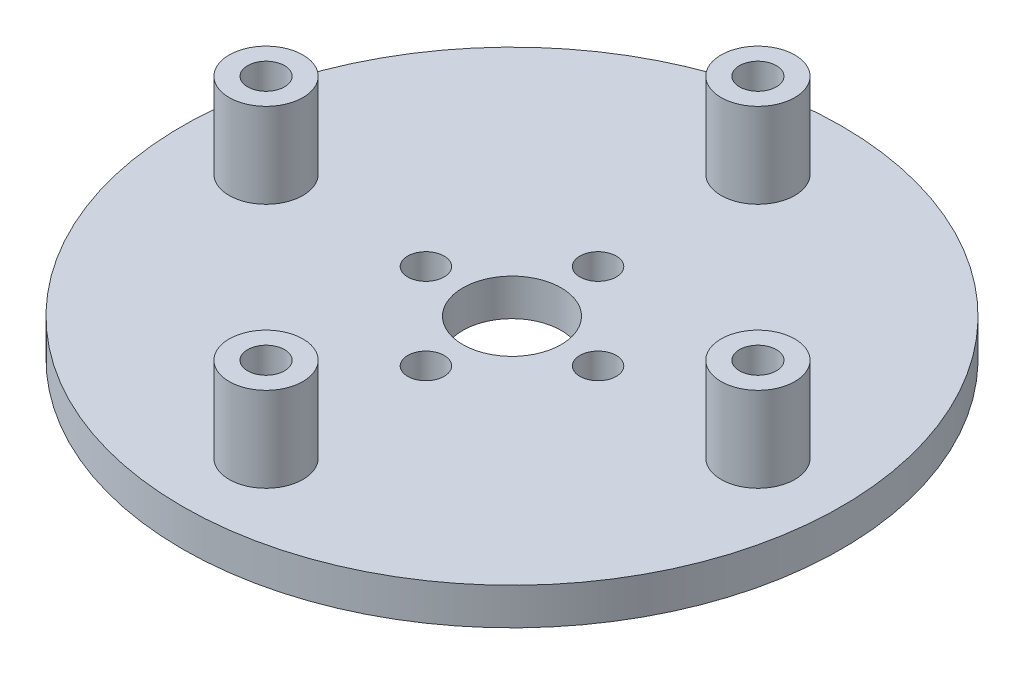
ISO-10303-21;
HEADER;
FILE_DESCRIPTION(('STEP AP214'),'2;1');
FILE_NAME('part.step','',(''),(''),'','','');
FILE_SCHEMA(('AUTOMOTIVE_DESIGN { 1 0 10303 214 1 1 1 1 }'));
ENDSEC;
DATA;
#1=APPLICATION_CONTEXT('core data for automotive mechanical design processes');
#2=APPLICATION_PROTOCOL_DEFINITION('international standard','automotive_design',2000,#1);
#3=PRODUCT_CONTEXT('',#1,'mechanical');
#4=PRODUCT('Part','Part','',(#3));
#5=PRODUCT_RELATED_PRODUCT_CATEGORY('part','',(#4));
#6=PRODUCT_DEFINITION_FORMATION('','',#4);
#7=PRODUCT_DEFINITION_CONTEXT('part definition',#1,'design');
#8=PRODUCT_DEFINITION('design','',#6,#7);
#9=PRODUCT_DEFINITION_SHAPE('','',#8);
#10=(LENGTH_UNIT() NAMED_UNIT(*) SI_UNIT(.MILLI.,.METRE.));
#11=(NAMED_UNIT(*) PLANE_ANGLE_UNIT() SI_UNIT($,.RADIAN.));
#12=(NAMED_UNIT(*) SI_UNIT($,.STERADIAN.) SOLID_ANGLE_UNIT());
#13=UNCERTAINTY_MEASURE_WITH_UNIT(LENGTH_MEASURE(1.E-05),#10,'distance_accuracy_value','');
#14=(GEOMETRIC_REPRESENTATION_CONTEXT(3) GLOBAL_UNCERTAINTY_ASSIGNED_CONTEXT((#13)) GLOBAL_UNIT_ASSIGNED_CONTEXT((#10,
#11,#12)) REPRESENTATION_CONTEXT('',''));
#15=CARTESIAN_POINT('',(0.,0.,0.));
#16=DIRECTION('',(0.,0.,1.));
#17=DIRECTION('',(1.,0.,0.));
#18=AXIS2_PLACEMENT_3D('',#15,#16,#17);
#19=CARTESIAN_POINT('',(0.,3.,-20.));
#20=DIRECTION('',(0.,-1.,0.));
#21=DIRECTION('',(0.,0.,-1.));
#22=AXIS2_PLACEMENT_3D('',#19,#20,#21);
#23=CYLINDRICAL_SURFACE('',#22,1.5);
#24=CARTESIAN_POINT('',(0.,9.9,-20.));
#25=DIRECTION('',(0.,1.,0.));
#26=DIRECTION('',(0.,0.,1.));
#27=AXIS2_PLACEMENT_3D('',#24,#25,#26);
#28=CIRCLE('',#27,1.5);
#29=CARTESIAN_POINT('',(0.,9.9,-18.5));
#30=VERTEX_POINT('',#29);
#31=EDGE_CURVE('E97',#30,#30,#28,.T.);
#32=ORIENTED_EDGE('',*,*,#31,.T.);
#33=EDGE_LOOP('',(#32));
#34=FACE_BOUND('',#33,.T.);
#35=CARTESIAN_POINT('',(0.,2.,-20.));
#36=DIRECTION('',(0.,-1.,0.));
#37=DIRECTION('',(0.,0.,-1.));
#38=AXIS2_PLACEMENT_3D('',#35,#36,#37);
#39=CIRCLE('',#38,1.5);
#40=CARTESIAN_POINT('',(0.,2.,-21.5));
#41=VERTEX_POINT('',#40);
#42=EDGE_CURVE('E38',#41,#41,#39,.T.);
#43=ORIENTED_EDGE('',*,*,#42,.T.);
#44=EDGE_LOOP('',(#43));
#45=FACE_BOUND('',#44,.T.);
#46=ADVANCED_FACE('F34',(#34,#45),#23,.F.);
#47=CARTESIAN_POINT('',(20.,3.,0.));
#48=DIRECTION('',(0.,-1.,0.));
#49=DIRECTION('',(0.,0.,-1.));
#50=AXIS2_PLACEMENT_3D('',#47,#48,#49);
#51=CYLINDRICAL_SURFACE('',#50,1.5);
#52=CARTESIAN_POINT('',(20.,9.9,0.));
#53=DIRECTION('',(0.,1.,0.));
#54=DIRECTION('',(0.,0.,1.));
#55=AXIS2_PLACEMENT_3D('',#52,#53,#54);
#56=CIRCLE('',#55,1.5);
#57=CARTESIAN_POINT('',(20.,9.9,1.5));
#58=VERTEX_POINT('',#57);
#59=EDGE_CURVE('E80',#58,#58,#56,.T.);
#60=ORIENTED_EDGE('',*,*,#59,.T.);
#61=EDGE_LOOP('',(#60));
#62=FACE_BOUND('',#61,.T.);
#63=CARTESIAN_POINT('',(20.,2.,0.));
#64=DIRECTION('',(0.,-1.,0.));
#65=DIRECTION('',(0.,0.,-1.));
#66=AXIS2_PLACEMENT_3D('',#63,#64,#65);
#67=CIRCLE('',#66,1.5);
#68=CARTESIAN_POINT('',(20.,2.,-1.5));
#69=VERTEX_POINT('',#68);
#70=EDGE_CURVE('E59',#69,#69,#67,.T.);
#71=ORIENTED_EDGE('',*,*,#70,.T.);
#72=EDGE_LOOP('',(#71));
#73=FACE_BOUND('',#72,.T.);
#74=ADVANCED_FACE('F154',(#62,#73),#51,.F.);
#75=CARTESIAN_POINT('',(0.,3.,20.));
#76=DIRECTION('',(0.,-1.,0.));
#77=DIRECTION('',(0.,0.,-1.));
#78=AXIS2_PLACEMENT_3D('',#75,#76,#77);
#79=CYLINDRICAL_SURFACE('',#78,1.5);
#80=CARTESIAN_POINT('',(0.,9.9,20.));
#81=DIRECTION('',(0.,1.,0.));
#82=DIRECTION('',(0.,0.,1.));
#83=AXIS2_PLACEMENT_3D('',#80,#81,#82);
#84=CIRCLE('',#83,1.5);
#85=CARTESIAN_POINT('',(0.,9.9,21.5));
#86=VERTEX_POINT('',#85);
#87=EDGE_CURVE('E64',#86,#86,#84,.T.);
#88=ORIENTED_EDGE('',*,*,#87,.T.);
#89=EDGE_LOOP('',(#88));
#90=FACE_BOUND('',#89,.T.);
#91=CARTESIAN_POINT('',(0.,2.,20.));
#92=DIRECTION('',(0.,-1.,0.));
#93=DIRECTION('',(0.,0.,-1.));
#94=AXIS2_PLACEMENT_3D('',#91,#92,#93);
#95=CIRCLE('',#94,1.5);
#96=CARTESIAN_POINT('',(0.,2.,18.5));
#97=VERTEX_POINT('',#96);
#98=EDGE_CURVE('E56',#97,#97,#95,.T.);
#99=ORIENTED_EDGE('',*,*,#98,.T.);
#100=EDGE_LOOP('',(#99));
#101=FACE_BOUND('',#100,.T.);
#102=ADVANCED_FACE('F160',(#90,#101),#79,.F.);
#103=CARTESIAN_POINT('',(-20.,3.,0.));
#104=DIRECTION('',(0.,-1.,0.));
#105=DIRECTION('',(0.,0.,-1.));
#106=AXIS2_PLACEMENT_3D('',#103,#104,#105);
#107=CYLINDRICAL_SURFACE('',#106,1.5);
#108=CARTESIAN_POINT('',(-20.,9.9,0.));
#109=DIRECTION('',(0.,1.,0.));
#110=DIRECTION('',(0.,0.,1.));
#111=AXIS2_PLACEMENT_3D('',#108,#109,#110);
#112=CIRCLE('',#111,1.5);
#113=CARTESIAN_POINT('',(-20.,9.9,1.5));
#114=VERTEX_POINT('',#113);
#115=EDGE_CURVE('E88',#114,#114,#112,.T.);
#116=ORIENTED_EDGE('',*,*,#115,.T.);
#117=EDGE_LOOP('',(#116));
#118=FACE_BOUND('',#117,.T.);
#119=CARTESIAN_POINT('',(-20.,2.,0.));
#120=DIRECTION('',(0.,-1.,0.));
#121=DIRECTION('',(0.,0.,-1.));
#122=AXIS2_PLACEMENT_3D('',#119,#120,#121);
#123=CIRCLE('',#122,1.5);
#124=CARTESIAN_POINT('',(-20.,2.,-1.5));
#125=VERTEX_POINT('',#124);
#126=EDGE_CURVE('E53',#125,#125,#123,.T.);
#127=ORIENTED_EDGE('',*,*,#126,.T.);
#128=EDGE_LOOP('',(#127));
#129=FACE_BOUND('',#128,.T.);
#130=ADVANCED_FACE('F174',(#118,#129),#107,.F.);
#131=CARTESIAN_POINT('',(0.,3.,0.));
#132=DIRECTION('',(0.,1.,0.));
#133=DIRECTION('',(0.,0.,1.));
#134=AXIS2_PLACEMENT_3D('',#131,#132,#133);
#135=PLANE('',#134);
#136=CARTESIAN_POINT('',(20.,3.,0.));
#137=DIRECTION('',(0.,1.,0.));
#138=DIRECTION('',(0.,0.,1.));
#139=AXIS2_PLACEMENT_3D('',#136,#137,#138);
#140=CIRCLE('',#139,3.);
#141=CARTESIAN_POINT('',(20.,3.,-3.));
#142=VERTEX_POINT('',#141);
#143=EDGE_CURVE('E84',#142,#142,#140,.T.);
#144=ORIENTED_EDGE('',*,*,#143,.F.);
#145=EDGE_LOOP('',(#144));
#146=FACE_BOUND('',#145,.T.);
#147=CARTESIAN_POINT('',(0.,3.,-20.));
#148=DIRECTION('',(0.,1.,0.));
#149=DIRECTION('',(0.,0.,1.));
#150=AXIS2_PLACEMENT_3D('',#147,#148,#149);
#151=CIRCLE('',#150,3.);
#152=CARTESIAN_POINT('',(0.,3.,-23.));
#153=VERTEX_POINT('',#152);
#154=EDGE_CURVE('E102',#153,#153,#151,.T.);
#155=ORIENTED_EDGE('',*,*,#154,.F.);
#156=EDGE_LOOP('',(#155));
#157=FACE_BOUND('',#156,.T.);
#158=CARTESIAN_POINT('',(0.,3.,7.));
#159=DIRECTION('',(0.,1.,0.));
#160=DIRECTION('',(0.,0.,1.));
#161=AXIS2_PLACEMENT_3D('',#158,#159,#160);
#162=CIRCLE('',#161,1.48);
#163=CARTESIAN_POINT('',(0.,3.,8.48));
#164=VERTEX_POINT('',#163);
#165=EDGE_CURVE('E121',#164,#164,#162,.T.);
#166=ORIENTED_EDGE('',*,*,#165,.F.);
#167=EDGE_LOOP('',(#166));
#168=FACE_BOUND('',#167,.T.);
#169=CARTESIAN_POINT('',(0.,3.,-7.));
#170=DIRECTION('',(0.,1.,0.));
#171=DIRECTION('',(0.,0.,1.));
#172=AXIS2_PLACEMENT_3D('',#169,#170,#171);
#173=CIRCLE('',#172,1.48);
#174=CARTESIAN_POINT('',(0.,3.,-5.52));
#175=VERTEX_POINT('',#174);
#176=EDGE_CURVE('E127',#175,#175,#173,.T.);
#177=ORIENTED_EDGE('',*,*,#176,.F.);
#178=EDGE_LOOP('',(#177));
#179=FACE_BOUND('',#178,.T.);
#180=CARTESIAN_POINT('',(0.,3.,0.));
#181=DIRECTION('',(0.,1.,0.));
#182=DIRECTION('',(0.,0.,1.));
#183=AXIS2_PLACEMENT_3D('',#180,#181,#182);
#184=CIRCLE('',#183,26.8);
#185=CARTESIAN_POINT('',(0.,3.,26.8));
#186=VERTEX_POINT('',#185);
#187=EDGE_CURVE('E10',#186,#186,#184,.T.);
#188=ORIENTED_EDGE('',*,*,#187,.T.);
#189=EDGE_LOOP('',(#188));
#190=FACE_BOUND('',#189,.T.);
#191=CARTESIAN_POINT('',(0.,3.,0.));
#192=DIRECTION('',(0.,1.,0.));
#193=DIRECTION('',(0.,0.,1.));
#194=AXIS2_PLACEMENT_3D('',#191,#192,#193);
#195=CIRCLE('',#194,4.);
#196=CARTESIAN_POINT('',(0.,3.,4.));
#197=VERTEX_POINT('',#196);
#198=EDGE_CURVE('E47',#197,#197,#195,.T.);
#199=ORIENTED_EDGE('',*,*,#198,.F.);
#200=EDGE_LOOP('',(#199));
#201=FACE_BOUND('',#200,.T.);
#202=CARTESIAN_POINT('',(7.,3.,0.));
#203=DIRECTION('',(0.,1.,0.));
#204=DIRECTION('',(0.,0.,1.));
#205=AXIS2_PLACEMENT_3D('',#202,#203,#204);
#206=CIRCLE('',#205,1.48);
#207=CARTESIAN_POINT('',(7.,3.,1.48));
#208=VERTEX_POINT('',#207);
#209=EDGE_CURVE('E115',#208,#208,#206,.T.);
#210=ORIENTED_EDGE('',*,*,#209,.F.);
#211=EDGE_LOOP('',(#210));
#212=FACE_BOUND('',#211,.T.);
#213=CARTESIAN_POINT('',(-7.,3.,0.));
#214=DIRECTION('',(0.,1.,0.));
#215=DIRECTION('',(0.,0.,1.));
#216=AXIS2_PLACEMENT_3D('',#213,#214,#215);
#217=CIRCLE('',#216,1.48);
#218=CARTESIAN_POINT('',(-7.,3.,1.48));
#219=VERTEX_POINT('',#218);
#220=EDGE_CURVE('E109',#219,#219,#217,.T.);
#221=ORIENTED_EDGE('',*,*,#220,.F.);
#222=EDGE_LOOP('',(#221));
#223=FACE_BOUND('',#222,.T.);
#224=CARTESIAN_POINT('',(-20.,3.,0.));
#225=DIRECTION('',(0.,1.,0.));
#226=DIRECTION('',(0.,0.,1.));
#227=AXIS2_PLACEMENT_3D('',#224,#225,#226);
#228=CIRCLE('',#227,3.);
#229=CARTESIAN_POINT('',(-20.,3.,-3.));
#230=VERTEX_POINT('',#229);
#231=EDGE_CURVE('E93',#230,#230,#228,.T.);
#232=ORIENTED_EDGE('',*,*,#231,.F.);
#233=EDGE_LOOP('',(#232));
#234=FACE_BOUND('',#233,.T.);
#235=CARTESIAN_POINT('',(0.,3.,20.));
#236=DIRECTION('',(0.,1.,0.));
#237=DIRECTION('',(0.,0.,1.));
#238=AXIS2_PLACEMENT_3D('',#235,#236,#237);
#239=CIRCLE('',#238,3.);
#240=CARTESIAN_POINT('',(0.,3.,17.));
#241=VERTEX_POINT('',#240);
#242=EDGE_CURVE('E68',#241,#241,#239,.T.);
#243=ORIENTED_EDGE('',*,*,#242,.F.);
#244=EDGE_LOOP('',(#243));
#245=FACE_BOUND('',#244,.T.);
#246=ADVANCED_FACE('F177',(#146,#157,#168,#179,#190,#201,#212,#223,#234,#245),#135,.T.);
#247=CARTESIAN_POINT('',(0.,0.,0.));
#248=DIRECTION('',(0.,1.,0.));
#249=DIRECTION('',(0.,0.,1.));
#250=AXIS2_PLACEMENT_3D('',#247,#248,#249);
#251=PLANE('',#250);
#252=CARTESIAN_POINT('',(0.,0.,20.));
#253=DIRECTION('',(0.,-1.,0.));
#254=DIRECTION('',(0.,0.,-1.));
#255=AXIS2_PLACEMENT_3D('',#252,#253,#254);
#256=CIRCLE('',#255,3.);
#257=CARTESIAN_POINT('',(0.,0.,17.));
#258=VERTEX_POINT('',#257);
#259=EDGE_CURVE('E251',#258,#258,#256,.T.);
#260=ORIENTED_EDGE('',*,*,#259,.F.);
#261=EDGE_LOOP('',(#260));
#262=FACE_BOUND('',#261,.T.);
#263=CARTESIAN_POINT('',(-20.,0.,0.));
#264=DIRECTION('',(0.,-1.,0.));
#265=DIRECTION('',(0.,0.,-1.));
#266=AXIS2_PLACEMENT_3D('',#263,#264,#265);
#267=CIRCLE('',#266,3.);
#268=CARTESIAN_POINT('',(-20.,0.,-3.));
#269=VERTEX_POINT('',#268);
#270=EDGE_CURVE('E259',#269,#269,#267,.T.);
#271=ORIENTED_EDGE('',*,*,#270,.F.);
#272=EDGE_LOOP('',(#271));
#273=FACE_BOUND('',#272,.T.);
#274=CARTESIAN_POINT('',(0.,0.,-20.));
#275=DIRECTION('',(0.,-1.,0.));
#276=DIRECTION('',(0.,0.,-1.));
#277=AXIS2_PLACEMENT_3D('',#274,#275,#276);
#278=CIRCLE('',#277,3.);
#279=CARTESIAN_POINT('',(0.,0.,-23.));
#280=VERTEX_POINT('',#279);
#281=EDGE_CURVE('E265',#280,#280,#278,.T.);
#282=ORIENTED_EDGE('',*,*,#281,.F.);
#283=EDGE_LOOP('',(#282));
#284=FACE_BOUND('',#283,.T.);
#285=CARTESIAN_POINT('',(20.,0.,0.));
#286=DIRECTION('',(0.,-1.,0.));
#287=DIRECTION('',(0.,0.,-1.));
#288=AXIS2_PLACEMENT_3D('',#285,#286,#287);
#289=CIRCLE('',#288,3.);
#290=CARTESIAN_POINT('',(20.,0.,-3.));
#291=VERTEX_POINT('',#290);
#292=EDGE_CURVE('E77',#291,#291,#289,.T.);
#293=ORIENTED_EDGE('',*,*,#292,.F.);
#294=EDGE_LOOP('',(#293));
#295=FACE_BOUND('',#294,.T.);
#296=CARTESIAN_POINT('',(0.,0.,0.));
#297=DIRECTION('',(0.,1.,0.));
#298=DIRECTION('',(0.,0.,1.));
#299=AXIS2_PLACEMENT_3D('',#296,#297,#298);
#300=CIRCLE('',#299,26.8);
#301=CARTESIAN_POINT('',(0.,0.,26.8));
#302=VERTEX_POINT('',#301);
#303=EDGE_CURVE('E42',#302,#302,#300,.T.);
#304=ORIENTED_EDGE('',*,*,#303,.F.);
#305=EDGE_LOOP('',(#304));
#306=FACE_BOUND('',#305,.T.);
#307=CARTESIAN_POINT('',(0.,0.,0.));
#308=DIRECTION('',(0.,1.,0.));
#309=DIRECTION('',(0.,0.,1.));
#310=AXIS2_PLACEMENT_3D('',#307,#308,#309);
#311=CIRCLE('',#310,4.);
#312=CARTESIAN_POINT('',(0.,0.,4.));
#313=VERTEX_POINT('',#312);
#314=EDGE_CURVE('E50',#313,#313,#311,.T.);
#315=ORIENTED_EDGE('',*,*,#314,.T.);
#316=EDGE_LOOP('',(#315));
#317=FACE_BOUND('',#316,.T.);
#318=CARTESIAN_POINT('',(0.,0.,-7.));
#319=DIRECTION('',(0.,1.,0.));
#320=DIRECTION('',(0.,0.,1.));
#321=AXIS2_PLACEMENT_3D('',#318,#319,#320);
#322=CIRCLE('',#321,1.48);
#323=CARTESIAN_POINT('',(0.,0.,-5.52));
#324=VERTEX_POINT('',#323);
#325=EDGE_CURVE('E124',#324,#324,#322,.T.);
#326=ORIENTED_EDGE('',*,*,#325,.T.);
#327=EDGE_LOOP('',(#326));
#328=FACE_BOUND('',#327,.T.);
#329=CARTESIAN_POINT('',(0.,0.,7.));
#330=DIRECTION('',(0.,1.,0.));
#331=DIRECTION('',(0.,0.,1.));
#332=AXIS2_PLACEMENT_3D('',#329,#330,#331);
#333=CIRCLE('',#332,1.48);
#334=CARTESIAN_POINT('',(0.,0.,8.48));
#335=VERTEX_POINT('',#334);
#336=EDGE_CURVE('E118',#335,#335,#333,.T.);
#337=ORIENTED_EDGE('',*,*,#336,.T.);
#338=EDGE_LOOP('',(#337));
#339=FACE_BOUND('',#338,.T.);
#340=CARTESIAN_POINT('',(7.,0.,0.));
#341=DIRECTION('',(0.,1.,0.));
#342=DIRECTION('',(0.,0.,1.));
#343=AXIS2_PLACEMENT_3D('',#340,#341,#342);
#344=CIRCLE('',#343,1.48);
#345=CARTESIAN_POINT('',(7.,0.,1.48));
#346=VERTEX_POINT('',#345);
#347=EDGE_CURVE('E112',#346,#346,#344,.T.);
#348=ORIENTED_EDGE('',*,*,#347,.T.);
#349=EDGE_LOOP('',(#348));
#350=FACE_BOUND('',#349,.T.);
#351=CARTESIAN_POINT('',(-7.,0.,0.));
#352=DIRECTION('',(0.,1.,0.));
#353=DIRECTION('',(0.,0.,1.));
#354=AXIS2_PLACEMENT_3D('',#351,#352,#353);
#355=CIRCLE('',#354,1.48);
#356=CARTESIAN_POINT('',(-7.,0.,1.48));
#357=VERTEX_POINT('',#356);
#358=EDGE_CURVE('E106',#357,#357,#355,.T.);
#359=ORIENTED_EDGE('',*,*,#358,.T.);
#360=EDGE_LOOP('',(#359));
#361=FACE_BOUND('',#360,.T.);
#362=ADVANCED_FACE('F137',(#262,#273,#284,#295,#306,#317,#328,#339,#350,#361),#251,.F.);
#363=CARTESIAN_POINT('',(0.,3.,0.));
#364=DIRECTION('',(0.,-1.,0.));
#365=DIRECTION('',(0.,0.,-1.));
#366=AXIS2_PLACEMENT_3D('',#363,#364,#365);
#367=CYLINDRICAL_SURFACE('',#366,26.8);
#368=ORIENTED_EDGE('',*,*,#187,.F.);
#369=EDGE_LOOP('',(#368));
#370=FACE_BOUND('',#369,.T.);
#371=ORIENTED_EDGE('',*,*,#303,.T.);
#372=EDGE_LOOP('',(#371));
#373=FACE_BOUND('',#372,.T.);
#374=ADVANCED_FACE('F36',(#370,#373),#367,.T.);
#375=CARTESIAN_POINT('',(0.,3.,0.));
#376=DIRECTION('',(0.,-1.,0.));
#377=DIRECTION('',(0.,0.,-1.));
#378=AXIS2_PLACEMENT_3D('',#375,#376,#377);
#379=CYLINDRICAL_SURFACE('',#378,4.);
#380=ORIENTED_EDGE('',*,*,#198,.T.);
#381=EDGE_LOOP('',(#380));
#382=FACE_BOUND('',#381,.T.);
#383=ORIENTED_EDGE('',*,*,#314,.F.);
#384=EDGE_LOOP('',(#383));
#385=FACE_BOUND('',#384,.T.);
#386=ADVANCED_FACE('F140',(#382,#385),#379,.F.);
#387=CARTESIAN_POINT('',(0.,3.,-7.));
#388=DIRECTION('',(0.,-1.,0.));
#389=DIRECTION('',(0.,0.,-1.));
#390=AXIS2_PLACEMENT_3D('',#387,#388,#389);
#391=CYLINDRICAL_SURFACE('',#390,1.48);
#392=ORIENTED_EDGE('',*,*,#176,.T.);
#393=EDGE_LOOP('',(#392));
#394=FACE_BOUND('',#393,.T.);
#395=ORIENTED_EDGE('',*,*,#325,.F.);
#396=EDGE_LOOP('',(#395));
#397=FACE_BOUND('',#396,.T.);
#398=ADVANCED_FACE('F142',(#394,#397),#391,.F.);
#399=CARTESIAN_POINT('',(0.,3.,7.));
#400=DIRECTION('',(0.,-1.,0.));
#401=DIRECTION('',(0.,0.,-1.));
#402=AXIS2_PLACEMENT_3D('',#399,#400,#401);
#403=CYLINDRICAL_SURFACE('',#402,1.48);
#404=ORIENTED_EDGE('',*,*,#165,.T.);
#405=EDGE_LOOP('',(#404));
#406=FACE_BOUND('',#405,.T.);
#407=ORIENTED_EDGE('',*,*,#336,.F.);
#408=EDGE_LOOP('',(#407));
#409=FACE_BOUND('',#408,.T.);
#410=ADVANCED_FACE('F148',(#406,#409),#403,.F.);
#411=CARTESIAN_POINT('',(7.,3.,0.));
#412=DIRECTION('',(0.,-1.,0.));
#413=DIRECTION('',(0.,0.,-1.));
#414=AXIS2_PLACEMENT_3D('',#411,#412,#413);
#415=CYLINDRICAL_SURFACE('',#414,1.48);
#416=ORIENTED_EDGE('',*,*,#209,.T.);
#417=EDGE_LOOP('',(#416));
#418=FACE_BOUND('',#417,.T.);
#419=ORIENTED_EDGE('',*,*,#347,.F.);
#420=EDGE_LOOP('',(#419));
#421=FACE_BOUND('',#420,.T.);
#422=ADVANCED_FACE('F166',(#418,#421),#415,.F.);
#423=CARTESIAN_POINT('',(-7.,3.,0.));
#424=DIRECTION('',(0.,-1.,0.));
#425=DIRECTION('',(0.,0.,-1.));
#426=AXIS2_PLACEMENT_3D('',#423,#424,#425);
#427=CYLINDRICAL_SURFACE('',#426,1.48);
#428=ORIENTED_EDGE('',*,*,#220,.T.);
#429=EDGE_LOOP('',(#428));
#430=FACE_BOUND('',#429,.T.);
#431=ORIENTED_EDGE('',*,*,#358,.F.);
#432=EDGE_LOOP('',(#431));
#433=FACE_BOUND('',#432,.T.);
#434=ADVANCED_FACE('F169',(#430,#433),#427,.F.);
#435=CARTESIAN_POINT('',(0.,9.9,-20.));
#436=DIRECTION('',(0.,1.,0.));
#437=DIRECTION('',(0.,0.,1.));
#438=AXIS2_PLACEMENT_3D('',#435,#436,#437);
#439=PLANE('',#438);
#440=CARTESIAN_POINT('',(0.,9.9,-20.));
#441=DIRECTION('',(0.,1.,0.));
#442=DIRECTION('',(0.,0.,1.));
#443=AXIS2_PLACEMENT_3D('',#440,#441,#442);
#444=CIRCLE('',#443,3.);
#445=CARTESIAN_POINT('',(0.,9.9,-23.));
#446=VERTEX_POINT('',#445);
#447=EDGE_CURVE('E103',#446,#446,#444,.T.);
#448=ORIENTED_EDGE('',*,*,#447,.T.);
#449=EDGE_LOOP('',(#448));
#450=FACE_BOUND('',#449,.T.);
#451=ORIENTED_EDGE('',*,*,#31,.F.);
#452=EDGE_LOOP('',(#451));
#453=FACE_BOUND('',#452,.T.);
#454=ADVANCED_FACE('F181',(#450,#453),#439,.T.);
#455=CARTESIAN_POINT('',(0.,9.9,-20.));
#456=DIRECTION('',(0.,-1.,0.));
#457=DIRECTION('',(0.,0.,-1.));
#458=AXIS2_PLACEMENT_3D('',#455,#456,#457);
#459=CYLINDRICAL_SURFACE('',#458,3.);
#460=CARTESIAN_POINT('',(0.,9.9,-23.));
#461=CARTESIAN_POINT('',(0.,9.828125,-23.));
#462=CARTESIAN_POINT('',(0.,9.75625,-23.));
#463=CARTESIAN_POINT('',(0.,9.6125,-23.));
#464=CARTESIAN_POINT('',(0.,9.540625,-23.));
#465=CARTESIAN_POINT('',(0.,9.396875,-23.));
#466=CARTESIAN_POINT('',(0.,9.325,-23.));
#467=CARTESIAN_POINT('',(0.,9.18125,-23.));
#468=CARTESIAN_POINT('',(0.,9.109375,-23.));
#469=CARTESIAN_POINT('',(0.,8.965625,-23.));
#470=CARTESIAN_POINT('',(0.,8.89375,-23.));
#471=CARTESIAN_POINT('',(0.,8.75,-23.));
#472=CARTESIAN_POINT('',(0.,8.678125,-23.));
#473=CARTESIAN_POINT('',(0.,8.534375,-23.));
#474=CARTESIAN_POINT('',(0.,8.4625,-23.));
#475=CARTESIAN_POINT('',(0.,8.31875,-23.));
#476=CARTESIAN_POINT('',(0.,8.246875,-23.));
#477=CARTESIAN_POINT('',(0.,8.103125,-23.));
#478=CARTESIAN_POINT('',(0.,8.03125,-23.));
#479=CARTESIAN_POINT('',(0.,7.8875,-23.));
#480=CARTESIAN_POINT('',(0.,7.815625,-23.));
#481=CARTESIAN_POINT('',(0.,7.671875,-23.));
#482=CARTESIAN_POINT('',(0.,7.6,-23.));
#483=CARTESIAN_POINT('',(0.,7.45625,-23.));
#484=CARTESIAN_POINT('',(0.,7.384375,-23.));
#485=CARTESIAN_POINT('',(0.,7.240625,-23.));
#486=CARTESIAN_POINT('',(0.,7.16875,-23.));
#487=CARTESIAN_POINT('',(0.,7.025,-23.));
#488=CARTESIAN_POINT('',(0.,6.953125,-23.));
#489=CARTESIAN_POINT('',(0.,6.809375,-23.));
#490=CARTESIAN_POINT('',(0.,6.7375,-23.));
#491=CARTESIAN_POINT('',(0.,6.59375,-23.));
#492=CARTESIAN_POINT('',(0.,6.521875,-23.));
#493=CARTESIAN_POINT('',(0.,6.378125,-23.));
#494=CARTESIAN_POINT('',(0.,6.30625,-23.));
#495=CARTESIAN_POINT('',(0.,6.1625,-23.));
#496=CARTESIAN_POINT('',(0.,6.090625,-23.));
#497=CARTESIAN_POINT('',(0.,5.946875,-23.));
#498=CARTESIAN_POINT('',(0.,5.875,-23.));
#499=CARTESIAN_POINT('',(0.,5.73125,-23.));
#500=CARTESIAN_POINT('',(0.,5.659375,-23.));
#501=CARTESIAN_POINT('',(0.,5.515625,-23.));
#502=CARTESIAN_POINT('',(0.,5.44375,-23.));
#503=CARTESIAN_POINT('',(0.,5.3,-23.));
#504=CARTESIAN_POINT('',(0.,5.228125,-23.));
#505=CARTESIAN_POINT('',(0.,5.084375,-23.));
#506=CARTESIAN_POINT('',(0.,5.0125,-23.));
#507=CARTESIAN_POINT('',(0.,4.86875,-23.));
#508=CARTESIAN_POINT('',(0.,4.796875,-23.));
#509=CARTESIAN_POINT('',(0.,4.653125,-23.));
#510=CARTESIAN_POINT('',(0.,4.58125,-23.));
#511=CARTESIAN_POINT('',(0.,4.4375,-23.));
#512=CARTESIAN_POINT('',(0.,4.365625,-23.));
#513=CARTESIAN_POINT('',(0.,4.221875,-23.));
#514=CARTESIAN_POINT('',(0.,4.15,-23.));
#515=CARTESIAN_POINT('',(0.,4.00625,-23.));
#516=CARTESIAN_POINT('',(0.,3.934375,-23.));
#517=CARTESIAN_POINT('',(0.,3.790625,-23.));
#518=CARTESIAN_POINT('',(0.,3.71875,-23.));
#519=CARTESIAN_POINT('',(0.,3.575,-23.));
#520=CARTESIAN_POINT('',(0.,3.503125,-23.));
#521=CARTESIAN_POINT('',(0.,3.359375,-23.));
#522=CARTESIAN_POINT('',(0.,3.2875,-23.));
#523=CARTESIAN_POINT('',(0.,3.14375,-23.));
#524=CARTESIAN_POINT('',(0.,3.071875,-23.));
#525=CARTESIAN_POINT('',(0.,3.,-23.));
#526=B_SPLINE_CURVE_WITH_KNOTS('',3,(#460,#461,#462,#463,#464,#465,#466,#467,#468,#469,#470,
#471,#472,#473,#474,#475,#476,#477,#478,#479,#480,#481,#482,#483,#484,#485,#486,#487,#488,#489,
#490,#491,#492,#493,#494,#495,#496,#497,#498,#499,#500,#501,#502,#503,#504,#505,#506,#507,#508,
#509,#510,#511,#512,#513,#514,#515,#516,#517,#518,#519,#520,#521,#522,#523,#524,#525),
.UNSPECIFIED.,.F.,.F.,(4,2,2,2,2,2,2,2,2,2,2,2,2,2,2,2,2,2,2,2,2,2,2,2,2,2,2,2,2,2,2,2,4),(0.,
0.215624999999999,0.431249999999999,0.646875,0.862499999999999,1.078125,1.29375,1.509375,1.725,
1.940625,2.15625,2.371875,2.5875,2.803125,3.01875,3.234375,3.45,3.665625,3.88125,4.096875,
4.3125,4.528125,4.74375,4.959375,5.175,5.390625,5.60625,5.821875,6.0375,6.253125,6.46875,
6.684375,6.9),.UNSPECIFIED.);
#527=EDGE_CURVE('BSEAM183',#446,#153,#526,.T.);
#528=ORIENTED_EDGE('',*,*,#447,.F.);
#529=ORIENTED_EDGE('',*,*,#154,.T.);
#530=ORIENTED_EDGE('',*,*,#527,.T.);
#531=ORIENTED_EDGE('',*,*,#527,.F.);
#532=EDGE_LOOP('',(#528,#530,#529,#531));
#533=FACE_BOUND('',#532,.T.);
#534=ADVANCED_FACE('F183',(#533),#459,.T.);
#535=CARTESIAN_POINT('',(-20.,9.9,0.));
#536=DIRECTION('',(0.,1.,0.));
#537=DIRECTION('',(0.,0.,1.));
#538=AXIS2_PLACEMENT_3D('',#535,#536,#537);
#539=PLANE('',#538);
#540=CARTESIAN_POINT('',(-20.,9.9,0.));
#541=DIRECTION('',(0.,1.,0.));
#542=DIRECTION('',(0.,0.,1.));
#543=AXIS2_PLACEMENT_3D('',#540,#541,#542);
#544=CIRCLE('',#543,3.);
#545=CARTESIAN_POINT('',(-20.,9.9,-3.));
#546=VERTEX_POINT('',#545);
#547=EDGE_CURVE('E94',#546,#546,#544,.T.);
#548=ORIENTED_EDGE('',*,*,#547,.T.);
#549=EDGE_LOOP('',(#548));
#550=FACE_BOUND('',#549,.T.);
#551=ORIENTED_EDGE('',*,*,#115,.F.);
#552=EDGE_LOOP('',(#551));
#553=FACE_BOUND('',#552,.T.);
#554=ADVANCED_FACE('F186',(#550,#553),#539,.T.);
#555=CARTESIAN_POINT('',(-20.,9.9,0.));
#556=DIRECTION('',(0.,-1.,0.));
#557=DIRECTION('',(0.,0.,-1.));
#558=AXIS2_PLACEMENT_3D('',#555,#556,#557);
#559=CYLINDRICAL_SURFACE('',#558,3.);
#560=CARTESIAN_POINT('',(-20.,9.9,-3.));
#561=CARTESIAN_POINT('',(-20.,9.828125,-3.));
#562=CARTESIAN_POINT('',(-20.,9.75625,-3.));
#563=CARTESIAN_POINT('',(-20.,9.6125,-3.));
#564=CARTESIAN_POINT('',(-20.,9.540625,-3.));
#565=CARTESIAN_POINT('',(-20.,9.396875,-3.));
#566=CARTESIAN_POINT('',(-20.,9.325,-3.));
#567=CARTESIAN_POINT('',(-20.,9.18125,-3.));
#568=CARTESIAN_POINT('',(-20.,9.109375,-3.));
#569=CARTESIAN_POINT('',(-20.,8.965625,-3.));
#570=CARTESIAN_POINT('',(-20.,8.89375,-3.));
#571=CARTESIAN_POINT('',(-20.,8.75,-3.));
#572=CARTESIAN_POINT('',(-20.,8.678125,-3.));
#573=CARTESIAN_POINT('',(-20.,8.534375,-3.));
#574=CARTESIAN_POINT('',(-20.,8.4625,-3.));
#575=CARTESIAN_POINT('',(-20.,8.31875,-3.));
#576=CARTESIAN_POINT('',(-20.,8.246875,-3.));
#577=CARTESIAN_POINT('',(-20.,8.103125,-3.));
#578=CARTESIAN_POINT('',(-20.,8.03125,-3.));
#579=CARTESIAN_POINT('',(-20.,7.8875,-3.));
#580=CARTESIAN_POINT('',(-20.,7.815625,-3.));
#581=CARTESIAN_POINT('',(-20.,7.671875,-3.));
#582=CARTESIAN_POINT('',(-20.,7.6,-3.));
#583=CARTESIAN_POINT('',(-20.,7.45625,-3.));
#584=CARTESIAN_POINT('',(-20.,7.384375,-3.));
#585=CARTESIAN_POINT('',(-20.,7.240625,-3.));
#586=CARTESIAN_POINT('',(-20.,7.16875,-3.));
#587=CARTESIAN_POINT('',(-20.,7.025,-3.));
#588=CARTESIAN_POINT('',(-20.,6.953125,-3.));
#589=CARTESIAN_POINT('',(-20.,6.809375,-3.));
#590=CARTESIAN_POINT('',(-20.,6.7375,-3.));
#591=CARTESIAN_POINT('',(-20.,6.59375,-3.));
#592=CARTESIAN_POINT('',(-20.,6.521875,-3.));
#593=CARTESIAN_POINT('',(-20.,6.378125,-3.));
#594=CARTESIAN_POINT('',(-20.,6.30625,-3.));
#595=CARTESIAN_POINT('',(-20.,6.1625,-3.));
#596=CARTESIAN_POINT('',(-20.,6.090625,-3.));
#597=CARTESIAN_POINT('',(-20.,5.946875,-3.));
#598=CARTESIAN_POINT('',(-20.,5.875,-3.));
#599=CARTESIAN_POINT('',(-20.,5.73125,-3.));
#600=CARTESIAN_POINT('',(-20.,5.659375,-3.));
#601=CARTESIAN_POINT('',(-20.,5.515625,-3.));
#602=CARTESIAN_POINT('',(-20.,5.44375,-3.));
#603=CARTESIAN_POINT('',(-20.,5.3,-3.));
#604=CARTESIAN_POINT('',(-20.,5.228125,-3.));
#605=CARTESIAN_POINT('',(-20.,5.084375,-3.));
#606=CARTESIAN_POINT('',(-20.,5.0125,-3.));
#607=CARTESIAN_POINT('',(-20.,4.86875,-3.));
#608=CARTESIAN_POINT('',(-20.,4.796875,-3.));
#609=CARTESIAN_POINT('',(-20.,4.653125,-3.));
#610=CARTESIAN_POINT('',(-20.,4.58125,-3.));
#611=CARTESIAN_POINT('',(-20.,4.4375,-3.));
#612=CARTESIAN_POINT('',(-20.,4.365625,-3.));
#613=CARTESIAN_POINT('',(-20.,4.221875,-3.));
#614=CARTESIAN_POINT('',(-20.,4.15,-3.));
#615=CARTESIAN_POINT('',(-20.,4.00625,-3.));
#616=CARTESIAN_POINT('',(-20.,3.934375,-3.));
#617=CARTESIAN_POINT('',(-20.,3.790625,-3.));
#618=CARTESIAN_POINT('',(-20.,3.71875,-3.));
#619=CARTESIAN_POINT('',(-20.,3.575,-3.));
#620=CARTESIAN_POINT('',(-20.,3.503125,-3.));
#621=CARTESIAN_POINT('',(-20.,3.359375,-3.));
#622=CARTESIAN_POINT('',(-20.,3.2875,-3.));
#623=CARTESIAN_POINT('',(-20.,3.14375,-3.));
#624=CARTESIAN_POINT('',(-20.,3.071875,-3.));
#625=CARTESIAN_POINT('',(-20.,3.,-3.));
#626=B_SPLINE_CURVE_WITH_KNOTS('',3,(#560,#561,#562,#563,#564,#565,#566,#567,#568,#569,#570,
#571,#572,#573,#574,#575,#576,#577,#578,#579,#580,#581,#582,#583,#584,#585,#586,#587,#588,#589,
#590,#591,#592,#593,#594,#595,#596,#597,#598,#599,#600,#601,#602,#603,#604,#605,#606,#607,#608,
#609,#610,#611,#612,#613,#614,#615,#616,#617,#618,#619,#620,#621,#622,#623,#624,#625),
.UNSPECIFIED.,.F.,.F.,(4,2,2,2,2,2,2,2,2,2,2,2,2,2,2,2,2,2,2,2,2,2,2,2,2,2,2,2,2,2,2,2,4),(0.,
0.215624999999999,0.431249999999999,0.646875,0.862499999999999,1.078125,1.29375,1.509375,1.725,
1.940625,2.15625,2.371875,2.5875,2.803125,3.01875,3.234375,3.45,3.665625,3.88125,4.096875,
4.3125,4.528125,4.74375,4.959375,5.175,5.390625,5.60625,5.821875,6.0375,6.253125,6.46875,
6.684375,6.9),.UNSPECIFIED.);
#627=EDGE_CURVE('BSEAM191',#546,#230,#626,.T.);
#628=ORIENTED_EDGE('',*,*,#547,.F.);
#629=ORIENTED_EDGE('',*,*,#231,.T.);
#630=ORIENTED_EDGE('',*,*,#627,.T.);
#631=ORIENTED_EDGE('',*,*,#627,.F.);
#632=EDGE_LOOP('',(#628,#630,#629,#631));
#633=FACE_BOUND('',#632,.T.);
#634=ADVANCED_FACE('F191',(#633),#559,.T.);
#635=CARTESIAN_POINT('',(20.,9.9,0.));
#636=DIRECTION('',(0.,1.,0.));
#637=DIRECTION('',(0.,0.,1.));
#638=AXIS2_PLACEMENT_3D('',#635,#636,#637);
#639=PLANE('',#638);
#640=CARTESIAN_POINT('',(20.,9.9,0.));
#641=DIRECTION('',(0.,1.,0.));
#642=DIRECTION('',(0.,0.,1.));
#643=AXIS2_PLACEMENT_3D('',#640,#641,#642);
#644=CIRCLE('',#643,3.);
#645=CARTESIAN_POINT('',(20.,9.9,-3.));
#646=VERTEX_POINT('',#645);
#647=EDGE_CURVE('E85',#646,#646,#644,.T.);
#648=ORIENTED_EDGE('',*,*,#647,.T.);
#649=EDGE_LOOP('',(#648));
#650=FACE_BOUND('',#649,.T.);
#651=ORIENTED_EDGE('',*,*,#59,.F.);
#652=EDGE_LOOP('',(#651));
#653=FACE_BOUND('',#652,.T.);
#654=ADVANCED_FACE('F194',(#650,#653),#639,.T.);
#655=CARTESIAN_POINT('',(20.,9.9,0.));
#656=DIRECTION('',(0.,-1.,0.));
#657=DIRECTION('',(0.,0.,-1.));
#658=AXIS2_PLACEMENT_3D('',#655,#656,#657);
#659=CYLINDRICAL_SURFACE('',#658,3.);
#660=CARTESIAN_POINT('',(20.,9.9,-3.));
#661=CARTESIAN_POINT('',(20.,9.828125,-3.));
#662=CARTESIAN_POINT('',(20.,9.75625,-3.));
#663=CARTESIAN_POINT('',(20.,9.6125,-3.));
#664=CARTESIAN_POINT('',(20.,9.540625,-3.));
#665=CARTESIAN_POINT('',(20.,9.396875,-3.));
#666=CARTESIAN_POINT('',(20.,9.325,-3.));
#667=CARTESIAN_POINT('',(20.,9.18125,-3.));
#668=CARTESIAN_POINT('',(20.,9.109375,-3.));
#669=CARTESIAN_POINT('',(20.,8.965625,-3.));
#670=CARTESIAN_POINT('',(20.,8.89375,-3.));
#671=CARTESIAN_POINT('',(20.,8.75,-3.));
#672=CARTESIAN_POINT('',(20.,8.678125,-3.));
#673=CARTESIAN_POINT('',(20.,8.534375,-3.));
#674=CARTESIAN_POINT('',(20.,8.4625,-3.));
#675=CARTESIAN_POINT('',(20.,8.31875,-3.));
#676=CARTESIAN_POINT('',(20.,8.246875,-3.));
#677=CARTESIAN_POINT('',(20.,8.103125,-3.));
#678=CARTESIAN_POINT('',(20.,8.03125,-3.));
#679=CARTESIAN_POINT('',(20.,7.8875,-3.));
#680=CARTESIAN_POINT('',(20.,7.815625,-3.));
#681=CARTESIAN_POINT('',(20.,7.671875,-3.));
#682=CARTESIAN_POINT('',(20.,7.6,-3.));
#683=CARTESIAN_POINT('',(20.,7.45625,-3.));
#684=CARTESIAN_POINT('',(20.,7.384375,-3.));
#685=CARTESIAN_POINT('',(20.,7.240625,-3.));
#686=CARTESIAN_POINT('',(20.,7.16875,-3.));
#687=CARTESIAN_POINT('',(20.,7.025,-3.));
#688=CARTESIAN_POINT('',(20.,6.953125,-3.));
#689=CARTESIAN_POINT('',(20.,6.809375,-3.));
#690=CARTESIAN_POINT('',(20.,6.7375,-3.));
#691=CARTESIAN_POINT('',(20.,6.59375,-3.));
#692=CARTESIAN_POINT('',(20.,6.521875,-3.));
#693=CARTESIAN_POINT('',(20.,6.378125,-3.));
#694=CARTESIAN_POINT('',(20.,6.30625,-3.));
#695=CARTESIAN_POINT('',(20.,6.1625,-3.));
#696=CARTESIAN_POINT('',(20.,6.090625,-3.));
#697=CARTESIAN_POINT('',(20.,5.946875,-3.));
#698=CARTESIAN_POINT('',(20.,5.875,-3.));
#699=CARTESIAN_POINT('',(20.,5.73125,-3.));
#700=CARTESIAN_POINT('',(20.,5.659375,-3.));
#701=CARTESIAN_POINT('',(20.,5.515625,-3.));
#702=CARTESIAN_POINT('',(20.,5.44375,-3.));
#703=CARTESIAN_POINT('',(20.,5.3,-3.));
#704=CARTESIAN_POINT('',(20.,5.228125,-3.));
#705=CARTESIAN_POINT('',(20.,5.084375,-3.));
#706=CARTESIAN_POINT('',(20.,5.0125,-3.));
#707=CARTESIAN_POINT('',(20.,4.86875,-3.));
#708=CARTESIAN_POINT('',(20.,4.796875,-3.));
#709=CARTESIAN_POINT('',(20.,4.653125,-3.));
#710=CARTESIAN_POINT('',(20.,4.58125,-3.));
#711=CARTESIAN_POINT('',(20.,4.4375,-3.));
#712=CARTESIAN_POINT('',(20.,4.365625,-3.));
#713=CARTESIAN_POINT('',(20.,4.221875,-3.));
#714=CARTESIAN_POINT('',(20.,4.15,-3.));
#715=CARTESIAN_POINT('',(20.,4.00625,-3.));
#716=CARTESIAN_POINT('',(20.,3.934375,-3.));
#717=CARTESIAN_POINT('',(20.,3.790625,-3.));
#718=CARTESIAN_POINT('',(20.,3.71875,-3.));
#719=CARTESIAN_POINT('',(20.,3.575,-3.));
#720=CARTESIAN_POINT('',(20.,3.503125,-3.));
#721=CARTESIAN_POINT('',(20.,3.359375,-3.));
#722=CARTESIAN_POINT('',(20.,3.2875,-3.));
#723=CARTESIAN_POINT('',(20.,3.14375,-3.));
#724=CARTESIAN_POINT('',(20.,3.071875,-3.));
#725=CARTESIAN_POINT('',(20.,3.,-3.));
#726=B_SPLINE_CURVE_WITH_KNOTS('',3,(#660,#661,#662,#663,#664,#665,#666,#667,#668,#669,#670,
#671,#672,#673,#674,#675,#676,#677,#678,#679,#680,#681,#682,#683,#684,#685,#686,#687,#688,#689,
#690,#691,#692,#693,#694,#695,#696,#697,#698,#699,#700,#701,#702,#703,#704,#705,#706,#707,#708,
#709,#710,#711,#712,#713,#714,#715,#716,#717,#718,#719,#720,#721,#722,#723,#724,#725),
.UNSPECIFIED.,.F.,.F.,(4,2,2,2,2,2,2,2,2,2,2,2,2,2,2,2,2,2,2,2,2,2,2,2,2,2,2,2,2,2,2,2,4),(0.,
0.215624999999999,0.431249999999999,0.646875,0.862499999999999,1.078125,1.29375,1.509375,1.725,
1.940625,2.15625,2.371875,2.5875,2.803125,3.01875,3.234375,3.45,3.665625,3.88125,4.096875,
4.3125,4.528125,4.74375,4.959375,5.175,5.390625,5.60625,5.821875,6.0375,6.253125,6.46875,
6.684375,6.9),.UNSPECIFIED.);
#727=EDGE_CURVE('BSEAM199',#646,#142,#726,.T.);
#728=ORIENTED_EDGE('',*,*,#647,.F.);
#729=ORIENTED_EDGE('',*,*,#143,.T.);
#730=ORIENTED_EDGE('',*,*,#727,.T.);
#731=ORIENTED_EDGE('',*,*,#727,.F.);
#732=EDGE_LOOP('',(#728,#730,#729,#731));
#733=FACE_BOUND('',#732,.T.);
#734=ADVANCED_FACE('F199',(#733),#659,.T.);
#735=CARTESIAN_POINT('',(0.,9.9,20.));
#736=DIRECTION('',(0.,1.,0.));
#737=DIRECTION('',(0.,0.,1.));
#738=AXIS2_PLACEMENT_3D('',#735,#736,#737);
#739=PLANE('',#738);
#740=CARTESIAN_POINT('',(0.,9.9,20.));
#741=DIRECTION('',(0.,1.,0.));
#742=DIRECTION('',(0.,0.,1.));
#743=AXIS2_PLACEMENT_3D('',#740,#741,#742);
#744=CIRCLE('',#743,3.);
#745=CARTESIAN_POINT('',(0.,9.9,17.));
#746=VERTEX_POINT('',#745);
#747=EDGE_CURVE('E73',#746,#746,#744,.T.);
#748=ORIENTED_EDGE('',*,*,#747,.T.);
#749=EDGE_LOOP('',(#748));
#750=FACE_BOUND('',#749,.T.);
#751=ORIENTED_EDGE('',*,*,#87,.F.);
#752=EDGE_LOOP('',(#751));
#753=FACE_BOUND('',#752,.T.);
#754=ADVANCED_FACE('F202',(#750,#753),#739,.T.);
#755=CARTESIAN_POINT('',(0.,9.9,20.));
#756=DIRECTION('',(0.,-1.,0.));
#757=DIRECTION('',(0.,0.,-1.));
#758=AXIS2_PLACEMENT_3D('',#755,#756,#757);
#759=CYLINDRICAL_SURFACE('',#758,3.);
#760=CARTESIAN_POINT('',(0.,9.9,17.));
#761=CARTESIAN_POINT('',(0.,9.828125,17.));
#762=CARTESIAN_POINT('',(0.,9.75625,17.));
#763=CARTESIAN_POINT('',(0.,9.6125,17.));
#764=CARTESIAN_POINT('',(0.,9.540625,17.));
#765=CARTESIAN_POINT('',(0.,9.396875,17.));
#766=CARTESIAN_POINT('',(0.,9.325,17.));
#767=CARTESIAN_POINT('',(0.,9.18125,17.));
#768=CARTESIAN_POINT('',(0.,9.109375,17.));
#769=CARTESIAN_POINT('',(0.,8.965625,17.));
#770=CARTESIAN_POINT('',(0.,8.89375,17.));
#771=CARTESIAN_POINT('',(0.,8.75,17.));
#772=CARTESIAN_POINT('',(0.,8.678125,17.));
#773=CARTESIAN_POINT('',(0.,8.534375,17.));
#774=CARTESIAN_POINT('',(0.,8.4625,17.));
#775=CARTESIAN_POINT('',(0.,8.31875,17.));
#776=CARTESIAN_POINT('',(0.,8.246875,17.));
#777=CARTESIAN_POINT('',(0.,8.103125,17.));
#778=CARTESIAN_POINT('',(0.,8.03125,17.));
#779=CARTESIAN_POINT('',(0.,7.8875,17.));
#780=CARTESIAN_POINT('',(0.,7.815625,17.));
#781=CARTESIAN_POINT('',(0.,7.671875,17.));
#782=CARTESIAN_POINT('',(0.,7.6,17.));
#783=CARTESIAN_POINT('',(0.,7.45625,17.));
#784=CARTESIAN_POINT('',(0.,7.384375,17.));
#785=CARTESIAN_POINT('',(0.,7.240625,17.));
#786=CARTESIAN_POINT('',(0.,7.16875,17.));
#787=CARTESIAN_POINT('',(0.,7.025,17.));
#788=CARTESIAN_POINT('',(0.,6.953125,17.));
#789=CARTESIAN_POINT('',(0.,6.809375,17.));
#790=CARTESIAN_POINT('',(0.,6.7375,17.));
#791=CARTESIAN_POINT('',(0.,6.59375,17.));
#792=CARTESIAN_POINT('',(0.,6.521875,17.));
#793=CARTESIAN_POINT('',(0.,6.378125,17.));
#794=CARTESIAN_POINT('',(0.,6.30625,17.));
#795=CARTESIAN_POINT('',(0.,6.1625,17.));
#796=CARTESIAN_POINT('',(0.,6.090625,17.));
#797=CARTESIAN_POINT('',(0.,5.946875,17.));
#798=CARTESIAN_POINT('',(0.,5.875,17.));
#799=CARTESIAN_POINT('',(0.,5.73125,17.));
#800=CARTESIAN_POINT('',(0.,5.659375,17.));
#801=CARTESIAN_POINT('',(0.,5.515625,17.));
#802=CARTESIAN_POINT('',(0.,5.44375,17.));
#803=CARTESIAN_POINT('',(0.,5.3,17.));
#804=CARTESIAN_POINT('',(0.,5.228125,17.));
#805=CARTESIAN_POINT('',(0.,5.084375,17.));
#806=CARTESIAN_POINT('',(0.,5.0125,17.));
#807=CARTESIAN_POINT('',(0.,4.86875,17.));
#808=CARTESIAN_POINT('',(0.,4.796875,17.));
#809=CARTESIAN_POINT('',(0.,4.653125,17.));
#810=CARTESIAN_POINT('',(0.,4.58125,17.));
#811=CARTESIAN_POINT('',(0.,4.4375,17.));
#812=CARTESIAN_POINT('',(0.,4.365625,17.));
#813=CARTESIAN_POINT('',(0.,4.221875,17.));
#814=CARTESIAN_POINT('',(0.,4.15,17.));
#815=CARTESIAN_POINT('',(0.,4.00625,17.));
#816=CARTESIAN_POINT('',(0.,3.934375,17.));
#817=CARTESIAN_POINT('',(0.,3.790625,17.));
#818=CARTESIAN_POINT('',(0.,3.71875,17.));
#819=CARTESIAN_POINT('',(0.,3.575,17.));
#820=CARTESIAN_POINT('',(0.,3.503125,17.));
#821=CARTESIAN_POINT('',(0.,3.359375,17.));
#822=CARTESIAN_POINT('',(0.,3.2875,17.));
#823=CARTESIAN_POINT('',(0.,3.14375,17.));
#824=CARTESIAN_POINT('',(0.,3.071875,17.));
#825=CARTESIAN_POINT('',(0.,3.,17.));
#826=B_SPLINE_CURVE_WITH_KNOTS('',3,(#760,#761,#762,#763,#764,#765,#766,#767,#768,#769,#770,
#771,#772,#773,#774,#775,#776,#777,#778,#779,#780,#781,#782,#783,#784,#785,#786,#787,#788,#789,
#790,#791,#792,#793,#794,#795,#796,#797,#798,#799,#800,#801,#802,#803,#804,#805,#806,#807,#808,
#809,#810,#811,#812,#813,#814,#815,#816,#817,#818,#819,#820,#821,#822,#823,#824,#825),
.UNSPECIFIED.,.F.,.F.,(4,2,2,2,2,2,2,2,2,2,2,2,2,2,2,2,2,2,2,2,2,2,2,2,2,2,2,2,2,2,2,2,4),(0.,
0.215624999999999,0.431249999999999,0.646875,0.862499999999999,1.078125,1.29375,1.509375,1.725,
1.940625,2.15625,2.371875,2.5875,2.803125,3.01875,3.234375,3.45,3.665625,3.88125,4.096875,
4.3125,4.528125,4.74375,4.959375,5.175,5.390625,5.60625,5.821875,6.0375,6.253125,6.46875,
6.684375,6.9),.UNSPECIFIED.);
#827=EDGE_CURVE('BSEAM207',#746,#241,#826,.T.);
#828=ORIENTED_EDGE('',*,*,#747,.F.);
#829=ORIENTED_EDGE('',*,*,#242,.T.);
#830=ORIENTED_EDGE('',*,*,#827,.T.);
#831=ORIENTED_EDGE('',*,*,#827,.F.);
#832=EDGE_LOOP('',(#828,#830,#829,#831));
#833=FACE_BOUND('',#832,.T.);
#834=ADVANCED_FACE('F207',(#833),#759,.T.);
#835=CARTESIAN_POINT('',(-20.,2.,0.));
#836=DIRECTION('',(0.,-1.,0.));
#837=DIRECTION('',(0.,0.,-1.));
#838=AXIS2_PLACEMENT_3D('',#835,#836,#837);
#839=CYLINDRICAL_SURFACE('',#838,3.);
#840=CARTESIAN_POINT('',(-20.,2.,0.));
#841=DIRECTION('',(0.,-1.,0.));
#842=DIRECTION('',(0.,0.,-1.));
#843=AXIS2_PLACEMENT_3D('',#840,#841,#842);
#844=CIRCLE('',#843,3.);
#845=CARTESIAN_POINT('',(-20.,2.,-3.));
#846=VERTEX_POINT('',#845);
#847=EDGE_CURVE('E254',#846,#846,#844,.T.);
#848=ORIENTED_EDGE('',*,*,#847,.F.);
#849=EDGE_LOOP('',(#848));
#850=FACE_BOUND('',#849,.T.);
#851=ORIENTED_EDGE('',*,*,#270,.T.);
#852=EDGE_LOOP('',(#851));
#853=FACE_BOUND('',#852,.T.);
#854=ADVANCED_FACE('F210',(#850,#853),#839,.F.);
#855=CARTESIAN_POINT('',(-20.,2.,0.));
#856=DIRECTION('',(0.,-1.,0.));
#857=DIRECTION('',(0.,0.,-1.));
#858=AXIS2_PLACEMENT_3D('',#855,#856,#857);
#859=PLANE('',#858);
#860=ORIENTED_EDGE('',*,*,#126,.F.);
#861=EDGE_LOOP('',(#860));
#862=FACE_BOUND('',#861,.T.);
#863=ORIENTED_EDGE('',*,*,#847,.T.);
#864=EDGE_LOOP('',(#863));
#865=FACE_BOUND('',#864,.T.);
#866=ADVANCED_FACE('F234',(#862,#865),#859,.T.);
#867=CARTESIAN_POINT('',(0.,2.,20.));
#868=DIRECTION('',(0.,-1.,0.));
#869=DIRECTION('',(0.,0.,-1.));
#870=AXIS2_PLACEMENT_3D('',#867,#868,#869);
#871=CYLINDRICAL_SURFACE('',#870,3.);
#872=CARTESIAN_POINT('',(0.,2.,20.));
#873=DIRECTION('',(0.,-1.,0.));
#874=DIRECTION('',(0.,0.,-1.));
#875=AXIS2_PLACEMENT_3D('',#872,#873,#874);
#876=CIRCLE('',#875,3.);
#877=CARTESIAN_POINT('',(0.,2.,17.));
#878=VERTEX_POINT('',#877);
#879=EDGE_CURVE('E57',#878,#878,#876,.T.);
#880=ORIENTED_EDGE('',*,*,#879,.F.);
#881=EDGE_LOOP('',(#880));
#882=FACE_BOUND('',#881,.T.);
#883=ORIENTED_EDGE('',*,*,#259,.T.);
#884=EDGE_LOOP('',(#883));
#885=FACE_BOUND('',#884,.T.);
#886=ADVANCED_FACE('F238',(#882,#885),#871,.F.);
#887=CARTESIAN_POINT('',(0.,2.,20.));
#888=DIRECTION('',(0.,-1.,0.));
#889=DIRECTION('',(0.,0.,-1.));
#890=AXIS2_PLACEMENT_3D('',#887,#888,#889);
#891=PLANE('',#890);
#892=ORIENTED_EDGE('',*,*,#98,.F.);
#893=EDGE_LOOP('',(#892));
#894=FACE_BOUND('',#893,.T.);
#895=ORIENTED_EDGE('',*,*,#879,.T.);
#896=EDGE_LOOP('',(#895));
#897=FACE_BOUND('',#896,.T.);
#898=ADVANCED_FACE('F219',(#894,#897),#891,.T.);
#899=CARTESIAN_POINT('',(20.,2.,0.));
#900=DIRECTION('',(0.,-1.,0.));
#901=DIRECTION('',(0.,0.,-1.));
#902=AXIS2_PLACEMENT_3D('',#899,#900,#901);
#903=CYLINDRICAL_SURFACE('',#902,3.);
#904=CARTESIAN_POINT('',(20.,2.,0.));
#905=DIRECTION('',(0.,-1.,0.));
#906=DIRECTION('',(0.,0.,-1.));
#907=AXIS2_PLACEMENT_3D('',#904,#905,#906);
#908=CIRCLE('',#907,3.);
#909=CARTESIAN_POINT('',(20.,2.,-3.));
#910=VERTEX_POINT('',#909);
#911=EDGE_CURVE('E267',#910,#910,#908,.T.);
#912=ORIENTED_EDGE('',*,*,#911,.F.);
#913=EDGE_LOOP('',(#912));
#914=FACE_BOUND('',#913,.T.);
#915=ORIENTED_EDGE('',*,*,#292,.T.);
#916=EDGE_LOOP('',(#915));
#917=FACE_BOUND('',#916,.T.);
#918=ADVANCED_FACE('F215',(#914,#917),#903,.F.);
#919=CARTESIAN_POINT('',(20.,2.,0.));
#920=DIRECTION('',(0.,-1.,0.));
#921=DIRECTION('',(0.,0.,-1.));
#922=AXIS2_PLACEMENT_3D('',#919,#920,#921);
#923=PLANE('',#922);
#924=ORIENTED_EDGE('',*,*,#70,.F.);
#925=EDGE_LOOP('',(#924));
#926=FACE_BOUND('',#925,.T.);
#927=ORIENTED_EDGE('',*,*,#911,.T.);
#928=EDGE_LOOP('',(#927));
#929=FACE_BOUND('',#928,.T.);
#930=ADVANCED_FACE('F218',(#926,#929),#923,.T.);
#931=CARTESIAN_POINT('',(0.,2.,-20.));
#932=DIRECTION('',(0.,-1.,0.));
#933=DIRECTION('',(0.,0.,-1.));
#934=AXIS2_PLACEMENT_3D('',#931,#932,#933);
#935=CYLINDRICAL_SURFACE('',#934,3.);
#936=CARTESIAN_POINT('',(0.,2.,-20.));
#937=DIRECTION('',(0.,-1.,0.));
#938=DIRECTION('',(0.,0.,-1.));
#939=AXIS2_PLACEMENT_3D('',#936,#937,#938);
#940=CIRCLE('',#939,3.);
#941=CARTESIAN_POINT('',(0.,2.,-23.));
#942=VERTEX_POINT('',#941);
#943=EDGE_CURVE('E262',#942,#942,#940,.T.);
#944=ORIENTED_EDGE('',*,*,#943,.F.);
#945=EDGE_LOOP('',(#944));
#946=FACE_BOUND('',#945,.T.);
#947=ORIENTED_EDGE('',*,*,#281,.T.);
#948=EDGE_LOOP('',(#947));
#949=FACE_BOUND('',#948,.T.);
#950=ADVANCED_FACE('F223',(#946,#949),#935,.F.);
#951=CARTESIAN_POINT('',(0.,2.,-20.));
#952=DIRECTION('',(0.,-1.,0.));
#953=DIRECTION('',(0.,0.,-1.));
#954=AXIS2_PLACEMENT_3D('',#951,#952,#953);
#955=PLANE('',#954);
#956=ORIENTED_EDGE('',*,*,#42,.F.);
#957=EDGE_LOOP('',(#956));
#958=FACE_BOUND('',#957,.T.);
#959=ORIENTED_EDGE('',*,*,#943,.T.);
#960=EDGE_LOOP('',(#959));
#961=FACE_BOUND('',#960,.T.);
#962=ADVANCED_FACE('F227',(#958,#961),#955,.T.);
#963=CLOSED_SHELL('',(#46,#74,#102,#130,#246,#362,#374,#386,#398,#410,#422,#434,#454,#534,#554,
#634,#654,#734,#754,#834,#854,#866,#886,#898,#918,#930,#950,#962));
#964=MANIFOLD_SOLID_BREP('B2',#963);
#965=ADVANCED_BREP_SHAPE_REPRESENTATION('',(#18,#964),#14);
#966=SHAPE_DEFINITION_REPRESENTATION(#9,#965);
ENDSEC;
END-ISO-10303-21;
